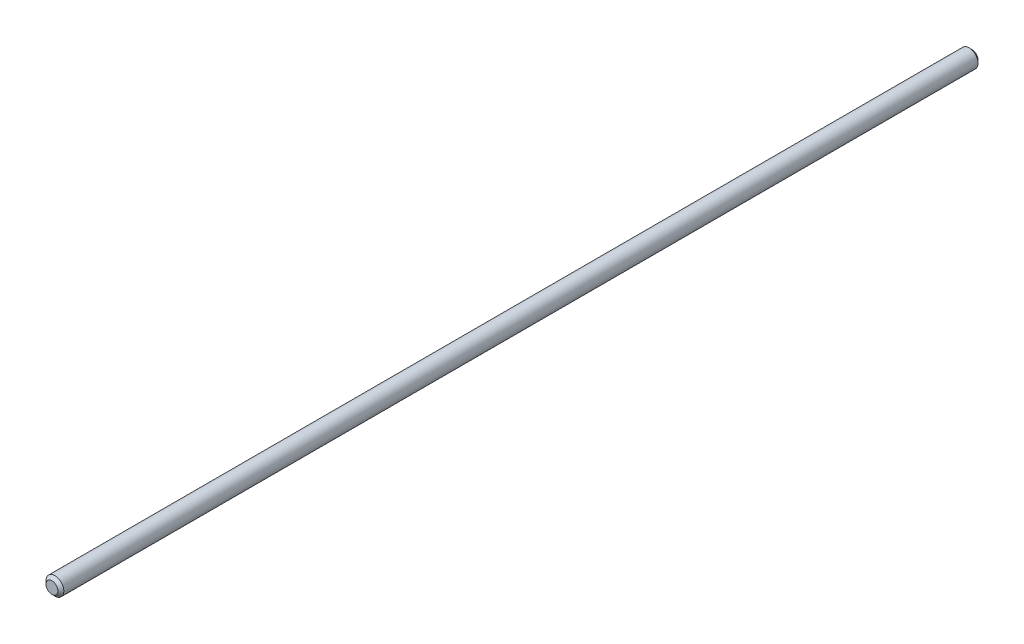
ISO-10303-21;
HEADER;
FILE_DESCRIPTION(('STEP AP214'),'2;1');
FILE_NAME('part.step','',(''),(''),'','','');
FILE_SCHEMA(('AUTOMOTIVE_DESIGN { 1 0 10303 214 1 1 1 1 }'));
ENDSEC;
DATA;
#1=APPLICATION_CONTEXT('core data for automotive mechanical design processes');
#2=APPLICATION_PROTOCOL_DEFINITION('international standard','automotive_design',2000,#1);
#3=PRODUCT_CONTEXT('',#1,'mechanical');
#4=PRODUCT('Part','Part','',(#3));
#5=PRODUCT_RELATED_PRODUCT_CATEGORY('part','',(#4));
#6=PRODUCT_DEFINITION_FORMATION('','',#4);
#7=PRODUCT_DEFINITION_CONTEXT('part definition',#1,'design');
#8=PRODUCT_DEFINITION('design','',#6,#7);
#9=PRODUCT_DEFINITION_SHAPE('','',#8);
#10=(LENGTH_UNIT() NAMED_UNIT(*) SI_UNIT(.MILLI.,.METRE.));
#11=(NAMED_UNIT(*) PLANE_ANGLE_UNIT() SI_UNIT($,.RADIAN.));
#12=(NAMED_UNIT(*) SI_UNIT($,.STERADIAN.) SOLID_ANGLE_UNIT());
#13=UNCERTAINTY_MEASURE_WITH_UNIT(LENGTH_MEASURE(1.E-05),#10,'distance_accuracy_value','');
#14=(GEOMETRIC_REPRESENTATION_CONTEXT(3) GLOBAL_UNCERTAINTY_ASSIGNED_CONTEXT((#13)) GLOBAL_UNIT_ASSIGNED_CONTEXT((#10,
#11,#12)) REPRESENTATION_CONTEXT('',''));
#15=CARTESIAN_POINT('',(0.,0.,0.));
#16=DIRECTION('',(0.,0.,1.));
#17=DIRECTION('',(1.,0.,0.));
#18=AXIS2_PLACEMENT_3D('',#15,#16,#17);
#19=CARTESIAN_POINT('',(0.,0.,310.));
#20=DIRECTION('',(0.,0.,-1.));
#21=DIRECTION('',(-1.,0.,0.));
#22=AXIS2_PLACEMENT_3D('',#19,#20,#21);
#23=CYLINDRICAL_SURFACE('',#22,3.);
#24=CARTESIAN_POINT('',(0.,0.,309.));
#25=DIRECTION('',(0.,0.,1.));
#26=DIRECTION('',(1.,0.,0.));
#27=AXIS2_PLACEMENT_3D('',#24,#25,#26);
#28=CIRCLE('',#27,3.);
#29=CARTESIAN_POINT('',(3.,0.,309.));
#30=VERTEX_POINT('',#29);
#31=EDGE_CURVE('E36',#30,#30,#28,.F.);
#32=ORIENTED_EDGE('',*,*,#31,.T.);
#33=EDGE_LOOP('',(#32));
#34=FACE_BOUND('',#33,.T.);
#35=CARTESIAN_POINT('',(0.,0.,0.999999999999945));
#36=DIRECTION('',(0.,0.,1.));
#37=DIRECTION('',(1.,0.,0.));
#38=AXIS2_PLACEMENT_3D('',#35,#36,#37);
#39=CIRCLE('',#38,3.);
#40=CARTESIAN_POINT('',(3.,0.,0.999999999999945));
#41=VERTEX_POINT('',#40);
#42=EDGE_CURVE('E40',#41,#41,#39,.T.);
#43=ORIENTED_EDGE('',*,*,#42,.T.);
#44=EDGE_LOOP('',(#43));
#45=FACE_BOUND('',#44,.T.);
#46=ADVANCED_FACE('F29',(#34,#45),#23,.T.);
#47=CARTESIAN_POINT('',(0.,0.,310.));
#48=DIRECTION('',(0.,0.,1.));
#49=DIRECTION('',(1.,0.,0.));
#50=AXIS2_PLACEMENT_3D('',#47,#48,#49);
#51=PLANE('',#50);
#52=CARTESIAN_POINT('',(0.,0.,310.));
#53=DIRECTION('',(0.,0.,1.));
#54=DIRECTION('',(1.,0.,0.));
#55=AXIS2_PLACEMENT_3D('',#52,#53,#54);
#56=CIRCLE('',#55,2.00000000000003);
#57=CARTESIAN_POINT('',(2.00000000000003,0.,310.));
#58=VERTEX_POINT('',#57);
#59=EDGE_CURVE('E44',#58,#58,#56,.T.);
#60=ORIENTED_EDGE('',*,*,#59,.T.);
#61=EDGE_LOOP('',(#60));
#62=FACE_BOUND('',#61,.T.);
#63=ADVANCED_FACE('F50',(#62),#51,.T.);
#64=CARTESIAN_POINT('',(0.,0.,0.));
#65=DIRECTION('',(0.,0.,1.));
#66=DIRECTION('',(1.,0.,0.));
#67=AXIS2_PLACEMENT_3D('',#64,#65,#66);
#68=PLANE('',#67);
#69=CARTESIAN_POINT('',(0.,0.,0.));
#70=DIRECTION('',(0.,0.,1.));
#71=DIRECTION('',(1.,0.,0.));
#72=AXIS2_PLACEMENT_3D('',#69,#70,#71);
#73=CIRCLE('',#72,2.00000000000003);
#74=CARTESIAN_POINT('',(2.00000000000003,0.,0.));
#75=VERTEX_POINT('',#74);
#76=EDGE_CURVE('E10',#75,#75,#73,.F.);
#77=ORIENTED_EDGE('',*,*,#76,.T.);
#78=EDGE_LOOP('',(#77));
#79=FACE_BOUND('',#78,.T.);
#80=ADVANCED_FACE('F54',(#79),#68,.F.);
#81=CARTESIAN_POINT('',(0.,0.,310.));
#82=DIRECTION('',(0.,0.,-1.));
#83=DIRECTION('',(-1.,0.,0.));
#84=AXIS2_PLACEMENT_3D('',#81,#82,#83);
#85=CONICAL_SURFACE('',#84,2.00000000000003,0.785398163397461);
#86=ORIENTED_EDGE('',*,*,#31,.F.);
#87=EDGE_LOOP('',(#86));
#88=FACE_BOUND('',#87,.T.);
#89=ORIENTED_EDGE('',*,*,#59,.F.);
#90=EDGE_LOOP('',(#89));
#91=FACE_BOUND('',#90,.T.);
#92=ADVANCED_FACE('F52',(#88,#91),#85,.T.);
#93=CARTESIAN_POINT('',(0.,0.,0.999999999999945));
#94=DIRECTION('',(0.,0.,1.));
#95=DIRECTION('',(1.,0.,0.));
#96=AXIS2_PLACEMENT_3D('',#93,#94,#95);
#97=CONICAL_SURFACE('',#96,3.,0.785398163397461);
#98=ORIENTED_EDGE('',*,*,#76,.F.);
#99=EDGE_LOOP('',(#98));
#100=FACE_BOUND('',#99,.T.);
#101=ORIENTED_EDGE('',*,*,#42,.F.);
#102=EDGE_LOOP('',(#101));
#103=FACE_BOUND('',#102,.T.);
#104=ADVANCED_FACE('F31',(#100,#103),#97,.T.);
#105=CLOSED_SHELL('',(#46,#63,#80,#92,#104));
#106=MANIFOLD_SOLID_BREP('B2',#105);
#107=ADVANCED_BREP_SHAPE_REPRESENTATION('',(#18,#106),#14);
#108=SHAPE_DEFINITION_REPRESENTATION(#9,#107);
ENDSEC;
END-ISO-10303-21;
